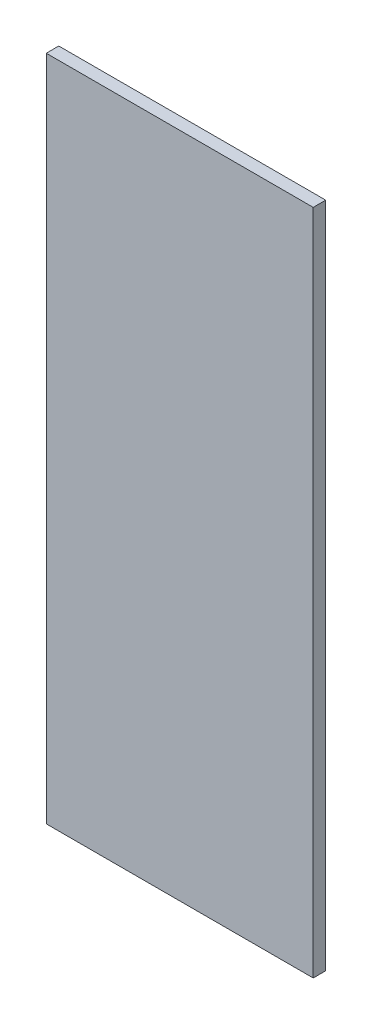
ISO-10303-21;
HEADER;
FILE_DESCRIPTION(('STEP AP214'),'2;1');
FILE_NAME('part.step','',(''),(''),'','','');
FILE_SCHEMA(('AUTOMOTIVE_DESIGN { 1 0 10303 214 1 1 1 1 }'));
ENDSEC;
DATA;
#1=APPLICATION_CONTEXT('core data for automotive mechanical design processes');
#2=APPLICATION_PROTOCOL_DEFINITION('international standard','automotive_design',2000,#1);
#3=PRODUCT_CONTEXT('',#1,'mechanical');
#4=PRODUCT('Part','Part','',(#3));
#5=PRODUCT_RELATED_PRODUCT_CATEGORY('part','',(#4));
#6=PRODUCT_DEFINITION_FORMATION('','',#4);
#7=PRODUCT_DEFINITION_CONTEXT('part definition',#1,'design');
#8=PRODUCT_DEFINITION('design','',#6,#7);
#9=PRODUCT_DEFINITION_SHAPE('','',#8);
#10=(LENGTH_UNIT() NAMED_UNIT(*) SI_UNIT(.MILLI.,.METRE.));
#11=(NAMED_UNIT(*) PLANE_ANGLE_UNIT() SI_UNIT($,.RADIAN.));
#12=(NAMED_UNIT(*) SI_UNIT($,.STERADIAN.) SOLID_ANGLE_UNIT());
#13=UNCERTAINTY_MEASURE_WITH_UNIT(LENGTH_MEASURE(1.E-05),#10,'distance_accuracy_value','');
#14=(GEOMETRIC_REPRESENTATION_CONTEXT(3) GLOBAL_UNCERTAINTY_ASSIGNED_CONTEXT((#13)) GLOBAL_UNIT_ASSIGNED_CONTEXT((#10,
#11,#12)) REPRESENTATION_CONTEXT('',''));
#15=CARTESIAN_POINT('',(0.,0.,0.));
#16=DIRECTION('',(0.,0.,1.));
#17=DIRECTION('',(1.,0.,0.));
#18=AXIS2_PLACEMENT_3D('',#15,#16,#17);
#19=CARTESIAN_POINT('',(160.,400.,15.));
#20=DIRECTION('',(-1.,0.,0.));
#21=DIRECTION('',(0.,-1.,0.));
#22=AXIS2_PLACEMENT_3D('',#19,#20,#21);
#23=PLANE('',#22);
#24=DIRECTION('',(0.,1.,0.));
#25=VECTOR('',#24,1.);
#26=CARTESIAN_POINT('',(160.,400.,0.));
#27=LINE('',#26,#25);
#28=CARTESIAN_POINT('',(160.,-400.,0.));
#29=VERTEX_POINT('',#28);
#30=CARTESIAN_POINT('',(160.,400.,0.));
#31=VERTEX_POINT('',#30);
#32=EDGE_CURVE('E107',#29,#31,#27,.T.);
#33=ORIENTED_EDGE('',*,*,#32,.T.);
#34=DIRECTION('',(0.,0.,-1.));
#35=VECTOR('',#34,1.);
#36=CARTESIAN_POINT('',(160.,400.,15.));
#37=LINE('',#36,#35);
#38=CARTESIAN_POINT('',(160.,400.,15.));
#39=VERTEX_POINT('',#38);
#40=EDGE_CURVE('E11',#39,#31,#37,.T.);
#41=ORIENTED_EDGE('',*,*,#40,.F.);
#42=DIRECTION('',(0.,1.,0.));
#43=VECTOR('',#42,1.);
#44=CARTESIAN_POINT('',(160.,400.,15.));
#45=LINE('',#44,#43);
#46=CARTESIAN_POINT('',(160.,-400.,15.));
#47=VERTEX_POINT('',#46);
#48=EDGE_CURVE('E91',#47,#39,#45,.T.);
#49=ORIENTED_EDGE('',*,*,#48,.F.);
#50=DIRECTION('',(0.,0.,-1.));
#51=VECTOR('',#50,1.);
#52=CARTESIAN_POINT('',(160.,-400.,15.));
#53=LINE('',#52,#51);
#54=EDGE_CURVE('E103',#47,#29,#53,.T.);
#55=ORIENTED_EDGE('',*,*,#54,.T.);
#56=EDGE_LOOP('',(#33,#41,#49,#55));
#57=FACE_BOUND('',#56,.T.);
#58=ADVANCED_FACE('F39',(#57),#23,.F.);
#59=CARTESIAN_POINT('',(-160.,400.,15.));
#60=DIRECTION('',(0.,-1.,0.));
#61=DIRECTION('',(0.,0.,-1.));
#62=AXIS2_PLACEMENT_3D('',#59,#60,#61);
#63=PLANE('',#62);
#64=DIRECTION('',(-1.,0.,0.));
#65=VECTOR('',#64,1.);
#66=CARTESIAN_POINT('',(-160.,400.,0.));
#67=LINE('',#66,#65);
#68=CARTESIAN_POINT('',(-160.,400.,0.));
#69=VERTEX_POINT('',#68);
#70=EDGE_CURVE('E96',#31,#69,#67,.T.);
#71=ORIENTED_EDGE('',*,*,#70,.T.);
#72=DIRECTION('',(0.,0.,-1.));
#73=VECTOR('',#72,1.);
#74=CARTESIAN_POINT('',(-160.,400.,15.));
#75=LINE('',#74,#73);
#76=CARTESIAN_POINT('',(-160.,400.,15.));
#77=VERTEX_POINT('',#76);
#78=EDGE_CURVE('E48',#77,#69,#75,.T.);
#79=ORIENTED_EDGE('',*,*,#78,.F.);
#80=DIRECTION('',(-1.,0.,0.));
#81=VECTOR('',#80,1.);
#82=CARTESIAN_POINT('',(-160.,400.,15.));
#83=LINE('',#82,#81);
#84=EDGE_CURVE('E86',#39,#77,#83,.T.);
#85=ORIENTED_EDGE('',*,*,#84,.F.);
#86=ORIENTED_EDGE('',*,*,#40,.T.);
#87=EDGE_LOOP('',(#71,#79,#85,#86));
#88=FACE_BOUND('',#87,.T.);
#89=ADVANCED_FACE('F95',(#88),#63,.F.);
#90=CARTESIAN_POINT('',(-160.,400.,15.));
#91=DIRECTION('',(1.,0.,0.));
#92=DIRECTION('',(0.,1.,0.));
#93=AXIS2_PLACEMENT_3D('',#90,#91,#92);
#94=PLANE('',#93);
#95=DIRECTION('',(0.,-1.,0.));
#96=VECTOR('',#95,1.);
#97=CARTESIAN_POINT('',(-160.,400.,0.));
#98=LINE('',#97,#96);
#99=CARTESIAN_POINT('',(-160.,-400.,0.));
#100=VERTEX_POINT('',#99);
#101=EDGE_CURVE('E73',#69,#100,#98,.T.);
#102=ORIENTED_EDGE('',*,*,#101,.T.);
#103=DIRECTION('',(0.,0.,-1.));
#104=VECTOR('',#103,1.);
#105=CARTESIAN_POINT('',(-160.,-400.,15.));
#106=LINE('',#105,#104);
#107=CARTESIAN_POINT('',(-160.,-400.,15.));
#108=VERTEX_POINT('',#107);
#109=EDGE_CURVE('E98',#108,#100,#106,.T.);
#110=ORIENTED_EDGE('',*,*,#109,.F.);
#111=DIRECTION('',(0.,-1.,0.));
#112=VECTOR('',#111,1.);
#113=CARTESIAN_POINT('',(-160.,400.,15.));
#114=LINE('',#113,#112);
#115=EDGE_CURVE('E89',#77,#108,#114,.T.);
#116=ORIENTED_EDGE('',*,*,#115,.F.);
#117=ORIENTED_EDGE('',*,*,#78,.T.);
#118=EDGE_LOOP('',(#102,#110,#116,#117));
#119=FACE_BOUND('',#118,.T.);
#120=ADVANCED_FACE('F99',(#119),#94,.F.);
#121=CARTESIAN_POINT('',(-160.,-400.,15.));
#122=DIRECTION('',(0.,1.,0.));
#123=DIRECTION('',(0.,0.,1.));
#124=AXIS2_PLACEMENT_3D('',#121,#122,#123);
#125=PLANE('',#124);
#126=DIRECTION('',(1.,0.,0.));
#127=VECTOR('',#126,1.);
#128=CARTESIAN_POINT('',(-160.,-400.,0.));
#129=LINE('',#128,#127);
#130=EDGE_CURVE('E79',#100,#29,#129,.T.);
#131=ORIENTED_EDGE('',*,*,#130,.T.);
#132=ORIENTED_EDGE('',*,*,#54,.F.);
#133=DIRECTION('',(1.,0.,0.));
#134=VECTOR('',#133,1.);
#135=CARTESIAN_POINT('',(-160.,-400.,15.));
#136=LINE('',#135,#134);
#137=EDGE_CURVE('E56',#108,#47,#136,.T.);
#138=ORIENTED_EDGE('',*,*,#137,.F.);
#139=ORIENTED_EDGE('',*,*,#109,.T.);
#140=EDGE_LOOP('',(#131,#132,#138,#139));
#141=FACE_BOUND('',#140,.T.);
#142=ADVANCED_FACE('F120',(#141),#125,.F.);
#143=CARTESIAN_POINT('',(0.,0.,15.));
#144=DIRECTION('',(0.,0.,1.));
#145=DIRECTION('',(1.,0.,0.));
#146=AXIS2_PLACEMENT_3D('',#143,#144,#145);
#147=PLANE('',#146);
#148=ORIENTED_EDGE('',*,*,#48,.T.);
#149=ORIENTED_EDGE('',*,*,#84,.T.);
#150=ORIENTED_EDGE('',*,*,#115,.T.);
#151=ORIENTED_EDGE('',*,*,#137,.T.);
#152=EDGE_LOOP('',(#148,#149,#150,#151));
#153=FACE_BOUND('',#152,.T.);
#154=ADVANCED_FACE('F87',(#153),#147,.T.);
#155=CARTESIAN_POINT('',(0.,0.,0.));
#156=DIRECTION('',(0.,0.,1.));
#157=DIRECTION('',(1.,0.,0.));
#158=AXIS2_PLACEMENT_3D('',#155,#156,#157);
#159=PLANE('',#158);
#160=ORIENTED_EDGE('',*,*,#32,.F.);
#161=ORIENTED_EDGE('',*,*,#130,.F.);
#162=ORIENTED_EDGE('',*,*,#101,.F.);
#163=ORIENTED_EDGE('',*,*,#70,.F.);
#164=EDGE_LOOP('',(#160,#161,#162,#163));
#165=FACE_BOUND('',#164,.T.);
#166=ADVANCED_FACE('F123',(#165),#159,.F.);
#167=CLOSED_SHELL('',(#58,#89,#120,#142,#154,#166));
#168=MANIFOLD_SOLID_BREP('B2',#167);
#169=ADVANCED_BREP_SHAPE_REPRESENTATION('',(#18,#168),#14);
#170=SHAPE_DEFINITION_REPRESENTATION(#9,#169);
ENDSEC;
END-ISO-10303-21;
